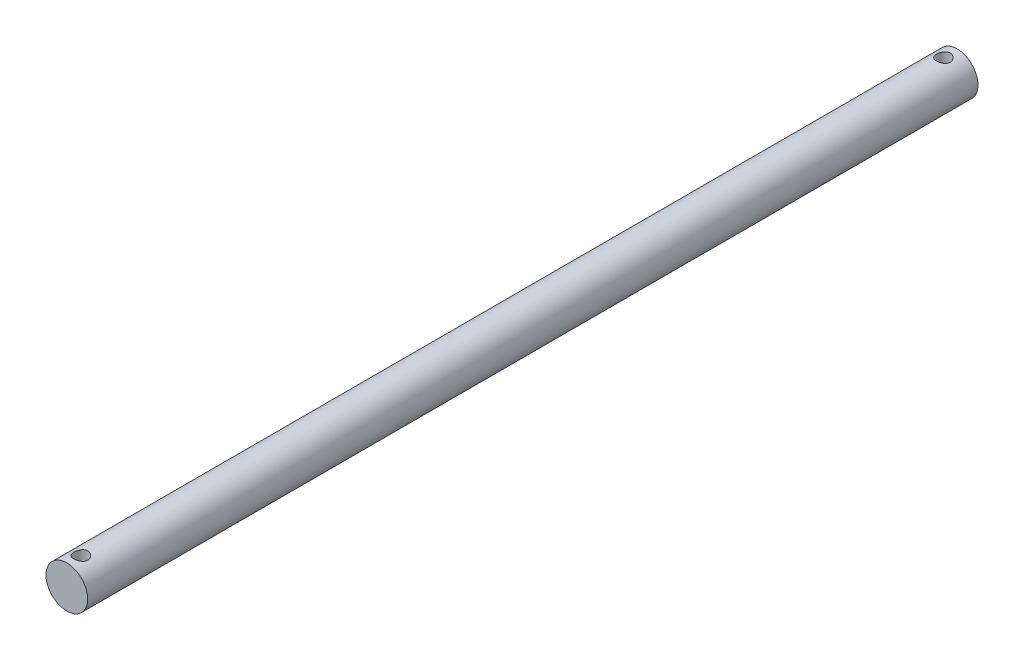
ISO-10303-21;
HEADER;
FILE_DESCRIPTION(('STEP AP214'),'2;1');
FILE_NAME('part.step','',(''),(''),'','','');
FILE_SCHEMA(('AUTOMOTIVE_DESIGN { 1 0 10303 214 1 1 1 1 }'));
ENDSEC;
DATA;
#1=APPLICATION_CONTEXT('core data for automotive mechanical design processes');
#2=APPLICATION_PROTOCOL_DEFINITION('international standard','automotive_design',2000,#1);
#3=PRODUCT_CONTEXT('',#1,'mechanical');
#4=PRODUCT('Part','Part','',(#3));
#5=PRODUCT_RELATED_PRODUCT_CATEGORY('part','',(#4));
#6=PRODUCT_DEFINITION_FORMATION('','',#4);
#7=PRODUCT_DEFINITION_CONTEXT('part definition',#1,'design');
#8=PRODUCT_DEFINITION('design','',#6,#7);
#9=PRODUCT_DEFINITION_SHAPE('','',#8);
#10=(LENGTH_UNIT() NAMED_UNIT(*) SI_UNIT(.MILLI.,.METRE.));
#11=(NAMED_UNIT(*) PLANE_ANGLE_UNIT() SI_UNIT($,.RADIAN.));
#12=(NAMED_UNIT(*) SI_UNIT($,.STERADIAN.) SOLID_ANGLE_UNIT());
#13=UNCERTAINTY_MEASURE_WITH_UNIT(LENGTH_MEASURE(1.E-05),#10,'distance_accuracy_value','');
#14=(GEOMETRIC_REPRESENTATION_CONTEXT(3) GLOBAL_UNCERTAINTY_ASSIGNED_CONTEXT((#13)) GLOBAL_UNIT_ASSIGNED_CONTEXT((#10,
#11,#12)) REPRESENTATION_CONTEXT('',''));
#15=CARTESIAN_POINT('',(0.,0.,0.));
#16=DIRECTION('',(0.,0.,1.));
#17=DIRECTION('',(1.,0.,0.));
#18=AXIS2_PLACEMENT_3D('',#15,#16,#17);
#19=CARTESIAN_POINT('',(0.,0.,101.6));
#20=DIRECTION('',(0.,0.,-1.));
#21=DIRECTION('',(-1.,0.,0.));
#22=AXIS2_PLACEMENT_3D('',#19,#20,#21);
#23=CYLINDRICAL_SURFACE('',#22,4.7625);
#24=CARTESIAN_POINT('',(0.,-4.7625,-96.8375));
#25=CARTESIAN_POINT('',(0.0866193385826736,-4.76250024290249,-96.837499597201));
#26=CARTESIAN_POINT('',(0.173236246329948,-4.76011509093227,-96.844612422477));
#27=CARTESIAN_POINT('',(0.343918795385844,-4.75083521197708,-96.8727887102473));
#28=CARTESIAN_POINT('',(0.427984170888624,-4.74394001683417,-96.8938536210189));
#29=CARTESIAN_POINT('',(0.591078303334069,-4.72638926301478,-96.9491317988722));
#30=CARTESIAN_POINT('',(0.670115223594078,-4.7157399927273,-96.9833230866541));
#31=CARTESIAN_POINT('',(0.821332712178452,-4.6917680757628,-97.0637841118809));
#32=CARTESIAN_POINT('',(0.893511924171946,-4.67844490185098,-97.1100562319416));
#33=CARTESIAN_POINT('',(1.03146490909785,-4.6500112492827,-97.2150484652133));
#34=CARTESIAN_POINT('',(1.09696837422357,-4.63485795886258,-97.2741120843885));
#35=CARTESIAN_POINT('',(1.21734689966456,-4.60470749718205,-97.4022803580967));
#36=CARTESIAN_POINT('',(1.27221961946452,-4.58971036098747,-97.471387217949));
#37=CARTESIAN_POINT('',(1.37132209578673,-4.56109915307672,-97.6201138703744));
#38=CARTESIAN_POINT('',(1.41520046242589,-4.54753724850155,-97.6999788118247));
#39=CARTESIAN_POINT('',(1.48878746228088,-4.52398297352029,-97.8664795499529));
#40=CARTESIAN_POINT('',(1.51850041960149,-4.51398951405184,-97.9531132709959));
#41=CARTESIAN_POINT('',(1.5618991201458,-4.49915443940136,-98.127618739126));
#42=CARTESIAN_POINT('',(1.57609134913143,-4.49415052034258,-98.2153503184764));
#43=CARTESIAN_POINT('',(1.58962903329348,-4.48938104899343,-98.3920812097225));
#44=CARTESIAN_POINT('',(1.58897907629749,-4.48961387798584,-98.4810801213758));
#45=CARTESIAN_POINT('',(1.57324409712918,-4.49514936325486,-98.6534994008299));
#46=CARTESIAN_POINT('',(1.55882008715261,-4.50021985189708,-98.7369888396339));
#47=CARTESIAN_POINT('',(1.51702478352345,-4.51447944137724,-98.9002870536258));
#48=CARTESIAN_POINT('',(1.4896519397146,-4.52366903532271,-98.9800953868782));
#49=CARTESIAN_POINT('',(1.42230325467059,-4.54529683920857,-99.1352677399765));
#50=CARTESIAN_POINT('',(1.38213155232278,-4.55778498196574,-99.2105394904329));
#51=CARTESIAN_POINT('',(1.29046145625624,-4.58458186738966,-99.3534825668941));
#52=CARTESIAN_POINT('',(1.23895979087786,-4.59889113542361,-99.4211516890067));
#53=CARTESIAN_POINT('',(1.12291706563305,-4.62863135053789,-99.5506829120802));
#54=CARTESIAN_POINT('',(1.05783562574614,-4.64408185600813,-99.6120574025332));
#55=CARTESIAN_POINT('',(0.918114067327475,-4.67371014689421,-99.7231483858281));
#56=CARTESIAN_POINT('',(0.84347303311154,-4.68788781016682,-99.7728637605861));
#57=CARTESIAN_POINT('',(0.685716835710946,-4.71355908851247,-99.8596178766232));
#58=CARTESIAN_POINT('',(0.602524951310933,-4.72502468137762,-99.8965259675034));
#59=CARTESIAN_POINT('',(0.430639669841156,-4.7437765034179,-99.9556725386547));
#60=CARTESIAN_POINT('',(0.341948195570989,-4.75106418427121,-99.9779161147347));
#61=CARTESIAN_POINT('',(0.16570932937777,-4.76039857975912,-100.00623836981));
#62=CARTESIAN_POINT('',(0.0782789897854428,-4.76265877911043,-100.012975947062));
#63=CARTESIAN_POINT('',(-0.0964804235618776,-4.76232383028039,-100.011971880662));
#64=CARTESIAN_POINT('',(-0.183809511919946,-4.75972950165738,-100.004232681032));
#65=CARTESIAN_POINT('',(-0.353250287758005,-4.75011789238403,-99.9750160964692));
#66=CARTESIAN_POINT('',(-0.435439830850313,-4.74323090454018,-99.9539431478964));
#67=CARTESIAN_POINT('',(-0.59508383424507,-4.72585806842736,-99.8991629069091));
#68=CARTESIAN_POINT('',(-0.67253768925741,-4.71537176124097,-99.8654540033449));
#69=CARTESIAN_POINT('',(-0.82278267052432,-4.69152178418573,-99.7853756894527));
#70=CARTESIAN_POINT('',(-0.895397560257222,-4.6780896842481,-99.738696583163));
#71=CARTESIAN_POINT('',(-1.03197791784025,-4.64987090592067,-99.6343667868536));
#72=CARTESIAN_POINT('',(-1.09594073387548,-4.63508381455201,-99.5767127460496));
#73=CARTESIAN_POINT('',(-1.2164258561425,-4.60496996168956,-99.448971232777));
#74=CARTESIAN_POINT('',(-1.27247803867766,-4.58964920726292,-99.3784378522536));
#75=CARTESIAN_POINT('',(-1.37200881668867,-4.5608870760535,-99.2286376361002));
#76=CARTESIAN_POINT('',(-1.41548730734048,-4.54744571493929,-99.1493707276684));
#77=CARTESIAN_POINT('',(-1.48843512703597,-4.52409546968821,-98.9843190882273));
#78=CARTESIAN_POINT('',(-1.51793278481197,-4.51417945258854,-98.8985479493196));
#79=CARTESIAN_POINT('',(-1.56193278348048,-4.49914696286489,-98.7228488930549));
#80=CARTESIAN_POINT('',(-1.57644187973938,-4.49402832815028,-98.6329228674206));
#81=CARTESIAN_POINT('',(-1.58952609843278,-4.48941600962756,-98.456437110035));
#82=CARTESIAN_POINT('',(-1.58888153347708,-4.48964685408647,-98.3699417847947));
#83=CARTESIAN_POINT('',(-1.5735971408498,-4.4950264084539,-98.1983604435612));
#84=CARTESIAN_POINT('',(-1.5589581461405,-4.50017482566362,-98.1132743439963));
#85=CARTESIAN_POINT('',(-1.51665275334284,-4.51460432334015,-97.9485346349836));
#86=CARTESIAN_POINT('',(-1.48923906179963,-4.52380505610683,-97.8688085403054));
#87=CARTESIAN_POINT('',(-1.4223672431436,-4.54527283124319,-97.7150264914855));
#88=CARTESIAN_POINT('',(-1.38290644257917,-4.55754055411886,-97.640971800489));
#89=CARTESIAN_POINT('',(-1.2910513494762,-4.58442741396348,-97.4971321739974));
#90=CARTESIAN_POINT('',(-1.23816783538878,-4.59912579731892,-97.4276745532363));
#91=CARTESIAN_POINT('',(-1.12179557697785,-4.62888578099664,-97.2983674212526));
#92=CARTESIAN_POINT('',(-1.05830383406674,-4.64394748298391,-97.2385206360952));
#93=CARTESIAN_POINT('',(-0.919545971611599,-4.67344173459301,-97.1277832454909));
#94=CARTESIAN_POINT('',(-0.843917402680823,-4.68782688609495,-97.0773325979453));
#95=CARTESIAN_POINT('',(-0.684779804883013,-4.71370010986522,-96.9899151941996));
#96=CARTESIAN_POINT('',(-0.601272797535096,-4.72518892253839,-96.9529449908487));
#97=CARTESIAN_POINT('',(-0.432583664931539,-4.7435375517131,-96.8950919084242));
#98=CARTESIAN_POINT('',(-0.34764306531129,-4.75058124720755,-96.8735640848069));
#99=CARTESIAN_POINT('',(-0.175133660416263,-4.76006171214452,-96.8447703044251));
#100=CARTESIAN_POINT('',(-0.0875655880903824,-4.76249975444399,-96.8375004071992));
#101=CARTESIAN_POINT('',(0.,-4.7625,-96.8375));
#102=B_SPLINE_CURVE_WITH_KNOTS('',3,(#24,#25,#26,#27,#28,#29,#30,#31,#32,#33,#34,#35,#36,#37,
#38,#39,#40,#41,#42,#43,#44,#45,#46,#47,#48,#49,#50,#51,#52,#53,#54,#55,#56,#57,#58,#59,#60,#61,
#62,#63,#64,#65,#66,#67,#68,#69,#70,#71,#72,#73,#74,#75,#76,#77,#78,#79,#80,#81,#82,#83,#84,#85,
#86,#87,#88,#89,#90,#91,#92,#93,#94,#95,#96,#97,#98,#99,#100,#101),.UNSPECIFIED.,.T.,.F.,(4,2,2,
2,2,2,2,2,2,2,2,2,2,2,2,2,2,2,2,2,2,2,2,2,2,2,2,2,2,2,2,2,2,2,2,2,2,2,4),(0.,0.259535780816295,
0.519098506612189,0.778228493181558,1.03740962475607,1.30468186298876,1.57201287843955,
1.8470306090726,2.12196433449873,2.38763057115172,2.65321468955133,2.90666212150156,
3.16013990233077,3.41769971708768,3.67533400311154,3.94641872975545,4.21752944222007,
4.49132968969943,4.76503474342568,5.02687563290582,5.2886723214813,5.54288575790413,
5.79713161888515,6.05806509751932,6.31907837054752,6.59195123823193,6.86482638073056,
7.13714621949997,7.40934326970521,7.6675561987701,7.92575375970308,8.17904744490163,
8.43239738104363,8.69680230873238,8.96128210158998,9.23606961575722,9.51078681329525,
9.7732303641843,10.0356013733555),.UNSPECIFIED.);
#103=CARTESIAN_POINT('',(0.,-4.7625,-96.8375));
#104=VERTEX_POINT('',#103);
#105=EDGE_CURVE('E49',#104,#104,#102,.T.);
#106=ORIENTED_EDGE('',*,*,#105,.T.);
#107=EDGE_LOOP('',(#106));
#108=FACE_BOUND('',#107,.T.);
#109=CARTESIAN_POINT('',(0.,4.7625,-96.8375));
#110=CARTESIAN_POINT('',(-0.0866193385826737,4.76250024290248,-96.837499597201));
#111=CARTESIAN_POINT('',(-0.173236246329949,4.76011509093227,-96.844612422477));
#112=CARTESIAN_POINT('',(-0.343918795385844,4.75083521197708,-96.8727887102473));
#113=CARTESIAN_POINT('',(-0.427984170888624,4.74394001683417,-96.8938536210189));
#114=CARTESIAN_POINT('',(-0.59107830333407,4.72638926301478,-96.9491317988722));
#115=CARTESIAN_POINT('',(-0.670115223594078,4.7157399927273,-96.9833230866541));
#116=CARTESIAN_POINT('',(-0.821332712178452,4.6917680757628,-97.0637841118809));
#117=CARTESIAN_POINT('',(-0.893511924171947,4.67844490185098,-97.1100562319416));
#118=CARTESIAN_POINT('',(-1.03146490909785,4.6500112492827,-97.2150484652133));
#119=CARTESIAN_POINT('',(-1.09696837422357,4.63485795886258,-97.2741120843885));
#120=CARTESIAN_POINT('',(-1.21734689966456,4.60470749718205,-97.4022803580967));
#121=CARTESIAN_POINT('',(-1.27221961946452,4.58971036098747,-97.471387217949));
#122=CARTESIAN_POINT('',(-1.37132209578673,4.56109915307672,-97.6201138703744));
#123=CARTESIAN_POINT('',(-1.41520046242589,4.54753724850155,-97.6999788118247));
#124=CARTESIAN_POINT('',(-1.48878746228088,4.52398297352029,-97.8664795499529));
#125=CARTESIAN_POINT('',(-1.51850041960149,4.51398951405184,-97.9531132709959));
#126=CARTESIAN_POINT('',(-1.5618991201458,4.49915443940136,-98.127618739126));
#127=CARTESIAN_POINT('',(-1.57609134913143,4.49415052034258,-98.2153503184764));
#128=CARTESIAN_POINT('',(-1.58962903329348,4.48938104899343,-98.3920812097225));
#129=CARTESIAN_POINT('',(-1.58897907629749,4.48961387798584,-98.4810801213758));
#130=CARTESIAN_POINT('',(-1.57324409712918,4.49514936325486,-98.6534994008299));
#131=CARTESIAN_POINT('',(-1.5588200871526,4.50021985189709,-98.7369888396339));
#132=CARTESIAN_POINT('',(-1.51702478352345,4.51447944137725,-98.9002870536259));
#133=CARTESIAN_POINT('',(-1.48965193971459,4.52366903532271,-98.9800953868782));
#134=CARTESIAN_POINT('',(-1.42230325467058,4.54529683920858,-99.1352677399765));
#135=CARTESIAN_POINT('',(-1.38213155232278,4.55778498196574,-99.2105394904329));
#136=CARTESIAN_POINT('',(-1.29046145625623,4.58458186738966,-99.3534825668941));
#137=CARTESIAN_POINT('',(-1.23895979087786,4.59889113542361,-99.4211516890067));
#138=CARTESIAN_POINT('',(-1.12291706563305,4.62863135053789,-99.5506829120802));
#139=CARTESIAN_POINT('',(-1.05783562574614,4.64408185600813,-99.6120574025332));
#140=CARTESIAN_POINT('',(-0.918114067327475,4.67371014689421,-99.7231483858281));
#141=CARTESIAN_POINT('',(-0.843473033111539,4.68788781016682,-99.7728637605861));
#142=CARTESIAN_POINT('',(-0.685716835710946,4.71355908851247,-99.8596178766232));
#143=CARTESIAN_POINT('',(-0.602524951310932,4.72502468137762,-99.8965259675034));
#144=CARTESIAN_POINT('',(-0.430639669841155,4.7437765034179,-99.9556725386547));
#145=CARTESIAN_POINT('',(-0.341948195570988,4.75106418427121,-99.9779161147347));
#146=CARTESIAN_POINT('',(-0.165709329377769,4.76039857975912,-100.00623836981));
#147=CARTESIAN_POINT('',(-0.0782789897854419,4.76265877911043,-100.012975947062));
#148=CARTESIAN_POINT('',(0.0964804235618788,4.76232383028039,-100.011971880662));
#149=CARTESIAN_POINT('',(0.183809511919947,4.75972950165738,-100.004232681032));
#150=CARTESIAN_POINT('',(0.353250287758007,4.75011789238403,-99.9750160964692));
#151=CARTESIAN_POINT('',(0.435439830850315,4.74323090454018,-99.9539431478964));
#152=CARTESIAN_POINT('',(0.595083834245073,4.72585806842736,-99.8991629069091));
#153=CARTESIAN_POINT('',(0.672537689257413,4.71537176124097,-99.8654540033449));
#154=CARTESIAN_POINT('',(0.822782670524323,4.69152178418573,-99.7853756894527));
#155=CARTESIAN_POINT('',(0.895397560257224,4.6780896842481,-99.738696583163));
#156=CARTESIAN_POINT('',(1.03197791784025,4.64987090592067,-99.6343667868536));
#157=CARTESIAN_POINT('',(1.09594073387548,4.63508381455201,-99.5767127460496));
#158=CARTESIAN_POINT('',(1.2164258561425,4.60496996168956,-99.448971232777));
#159=CARTESIAN_POINT('',(1.27247803867766,4.58964920726292,-99.3784378522536));
#160=CARTESIAN_POINT('',(1.37200881668867,4.5608870760535,-99.2286376361002));
#161=CARTESIAN_POINT('',(1.41548730734048,4.54744571493929,-99.1493707276684));
#162=CARTESIAN_POINT('',(1.48843512703598,4.52409546968821,-98.9843190882273));
#163=CARTESIAN_POINT('',(1.51793278481197,4.51417945258854,-98.8985479493196));
#164=CARTESIAN_POINT('',(1.56193278348048,4.49914696286489,-98.7228488930549));
#165=CARTESIAN_POINT('',(1.57644187973938,4.49402832815028,-98.6329228674206));
#166=CARTESIAN_POINT('',(1.58952609843278,4.48941600962756,-98.456437110035));
#167=CARTESIAN_POINT('',(1.58888153347708,4.48964685408647,-98.3699417847947));
#168=CARTESIAN_POINT('',(1.5735971408498,4.49502640845389,-98.1983604435612));
#169=CARTESIAN_POINT('',(1.5589581461405,4.50017482566362,-98.1132743439963));
#170=CARTESIAN_POINT('',(1.51665275334284,4.51460432334015,-97.9485346349836));
#171=CARTESIAN_POINT('',(1.48923906179963,4.52380505610683,-97.8688085403054));
#172=CARTESIAN_POINT('',(1.4223672431436,4.54527283124319,-97.7150264914855));
#173=CARTESIAN_POINT('',(1.38290644257917,4.55754055411886,-97.640971800489));
#174=CARTESIAN_POINT('',(1.2910513494762,4.58442741396348,-97.4971321739974));
#175=CARTESIAN_POINT('',(1.23816783538878,4.59912579731892,-97.4276745532363));
#176=CARTESIAN_POINT('',(1.12179557697785,4.62888578099664,-97.2983674212526));
#177=CARTESIAN_POINT('',(1.05830383406674,4.64394748298391,-97.2385206360952));
#178=CARTESIAN_POINT('',(0.919545971611597,4.67344173459301,-97.1277832454909));
#179=CARTESIAN_POINT('',(0.843917402680819,4.68782688609495,-97.0773325979453));
#180=CARTESIAN_POINT('',(0.684779804883009,4.71370010986522,-96.9899151941996));
#181=CARTESIAN_POINT('',(0.601272797535094,4.72518892253839,-96.9529449908487));
#182=CARTESIAN_POINT('',(0.43258366493154,4.7435375517131,-96.8950919084242));
#183=CARTESIAN_POINT('',(0.347643065311291,4.75058124720755,-96.8735640848069));
#184=CARTESIAN_POINT('',(0.175133660416263,4.76006171214452,-96.8447703044251));
#185=CARTESIAN_POINT('',(0.0875655880903825,4.76249975444399,-96.8375004071992));
#186=CARTESIAN_POINT('',(0.,4.7625,-96.8375));
#187=B_SPLINE_CURVE_WITH_KNOTS('',3,(#109,#110,#111,#112,#113,#114,#115,#116,#117,#118,#119,
#120,#121,#122,#123,#124,#125,#126,#127,#128,#129,#130,#131,#132,#133,#134,#135,#136,#137,#138,
#139,#140,#141,#142,#143,#144,#145,#146,#147,#148,#149,#150,#151,#152,#153,#154,#155,#156,#157,
#158,#159,#160,#161,#162,#163,#164,#165,#166,#167,#168,#169,#170,#171,#172,#173,#174,#175,#176,
#177,#178,#179,#180,#181,#182,#183,#184,#185,#186),.UNSPECIFIED.,.T.,.F.,(4,2,2,2,2,2,2,2,2,2,2,
2,2,2,2,2,2,2,2,2,2,2,2,2,2,2,2,2,2,2,2,2,2,2,2,2,2,2,4),(0.,0.259535780816295,0.51909850661219,
0.778228493181558,1.03740962475607,1.30468186298876,1.57201287843955,1.8470306090726,
2.12196433449873,2.38763057115172,2.65321468955133,2.90666212150158,3.16013990233078,
3.4176997170877,3.67533400311154,3.94641872975545,4.21752944222007,4.49132968969943,
4.76503474342568,5.02687563290582,5.2886723214813,5.54288575790414,5.79713161888515,
6.05806509751932,6.31907837054752,6.59195123823193,6.86482638073058,7.13714621949999,
7.40934326970522,7.66755619877011,7.92575375970308,8.17904744490163,8.43239738104363,
8.69680230873238,8.96128210158998,9.23606961575723,9.51078681329526,9.7732303641843,
10.0356013733555),.UNSPECIFIED.);
#188=CARTESIAN_POINT('',(0.,4.7625,-96.8375));
#189=VERTEX_POINT('',#188);
#190=EDGE_CURVE('E54',#189,#189,#187,.T.);
#191=ORIENTED_EDGE('',*,*,#190,.T.);
#192=EDGE_LOOP('',(#191));
#193=FACE_BOUND('',#192,.T.);
#194=CARTESIAN_POINT('',(0.,0.,101.6));
#195=DIRECTION('',(0.,0.,1.));
#196=DIRECTION('',(1.,0.,0.));
#197=AXIS2_PLACEMENT_3D('',#194,#195,#196);
#198=CIRCLE('',#197,4.7625);
#199=CARTESIAN_POINT('',(4.7625,0.,101.6));
#200=VERTEX_POINT('',#199);
#201=EDGE_CURVE('E79',#200,#200,#198,.T.);
#202=ORIENTED_EDGE('',*,*,#201,.F.);
#203=EDGE_LOOP('',(#202));
#204=FACE_BOUND('',#203,.T.);
#205=CARTESIAN_POINT('',(0.,0.,-101.6));
#206=DIRECTION('',(0.,0.,1.));
#207=DIRECTION('',(1.,0.,0.));
#208=AXIS2_PLACEMENT_3D('',#205,#206,#207);
#209=CIRCLE('',#208,4.7625);
#210=CARTESIAN_POINT('',(4.7625,0.,-101.6));
#211=VERTEX_POINT('',#210);
#212=EDGE_CURVE('E80',#211,#211,#209,.T.);
#213=ORIENTED_EDGE('',*,*,#212,.T.);
#214=EDGE_LOOP('',(#213));
#215=FACE_BOUND('',#214,.T.);
#216=CARTESIAN_POINT('',(0.,4.7625,100.0125));
#217=CARTESIAN_POINT('',(0.0866193385826738,4.76250024290248,100.012500402799));
#218=CARTESIAN_POINT('',(0.173236246329949,4.76011509093227,100.005387577523));
#219=CARTESIAN_POINT('',(0.343918795385844,4.75083521197708,99.9772112897527));
#220=CARTESIAN_POINT('',(0.427984170888624,4.74394001683417,99.9561463789811));
#221=CARTESIAN_POINT('',(0.59107830333407,4.72638926301478,99.9008682011278));
#222=CARTESIAN_POINT('',(0.670115223594078,4.7157399927273,99.8666769133459));
#223=CARTESIAN_POINT('',(0.821332712178452,4.6917680757628,99.7862158881191));
#224=CARTESIAN_POINT('',(0.893511924171947,4.67844490185098,99.7399437680584));
#225=CARTESIAN_POINT('',(1.03146490909785,4.6500112492827,99.6349515347867));
#226=CARTESIAN_POINT('',(1.09696837422357,4.63485795886258,99.5758879156115));
#227=CARTESIAN_POINT('',(1.21734689966456,4.60470749718205,99.4477196419033));
#228=CARTESIAN_POINT('',(1.27221961946452,4.58971036098747,99.378612782051));
#229=CARTESIAN_POINT('',(1.37132209578673,4.56109915307672,99.2298861296256));
#230=CARTESIAN_POINT('',(1.41520046242589,4.54753724850155,99.1500211881752));
#231=CARTESIAN_POINT('',(1.48878746228088,4.52398297352029,98.9835204500471));
#232=CARTESIAN_POINT('',(1.51850041960149,4.51398951405184,98.8968867290041));
#233=CARTESIAN_POINT('',(1.5618991201458,4.49915443940136,98.722381260874));
#234=CARTESIAN_POINT('',(1.57609134913143,4.49415052034258,98.6346496815236));
#235=CARTESIAN_POINT('',(1.58962903329348,4.48938104899343,98.4579187902775));
#236=CARTESIAN_POINT('',(1.58897907629749,4.48961387798584,98.3689198786242));
#237=CARTESIAN_POINT('',(1.57324409712918,4.49514936325486,98.1965005991701));
#238=CARTESIAN_POINT('',(1.5588200871526,4.50021985189709,98.1130111603661));
#239=CARTESIAN_POINT('',(1.51702478352345,4.51447944137725,97.9497129463741));
#240=CARTESIAN_POINT('',(1.48965193971459,4.52366903532271,97.8699046131218));
#241=CARTESIAN_POINT('',(1.42230325467058,4.54529683920858,97.7147322600235));
#242=CARTESIAN_POINT('',(1.38213155232278,4.55778498196574,97.6394605095671));
#243=CARTESIAN_POINT('',(1.29046145625623,4.58458186738966,97.4965174331059));
#244=CARTESIAN_POINT('',(1.23895979087786,4.59889113542361,97.4288483109933));
#245=CARTESIAN_POINT('',(1.12291706563305,4.62863135053789,97.2993170879198));
#246=CARTESIAN_POINT('',(1.05783562574615,4.64408185600813,97.2379425974669));
#247=CARTESIAN_POINT('',(0.918114067327479,4.67371014689421,97.1268516141719));
#248=CARTESIAN_POINT('',(0.843473033111542,4.68788781016682,97.0771362394139));
#249=CARTESIAN_POINT('',(0.685716835710947,4.71355908851247,96.9903821233768));
#250=CARTESIAN_POINT('',(0.602524951310933,4.72502468137762,96.9534740324966));
#251=CARTESIAN_POINT('',(0.430639669841155,4.7437765034179,96.8943274613453));
#252=CARTESIAN_POINT('',(0.341948195570988,4.75106418427121,96.8720838852653));
#253=CARTESIAN_POINT('',(0.165709329377769,4.76039857975912,96.8437616301895));
#254=CARTESIAN_POINT('',(0.0782789897854419,4.76265877911043,96.8370240529383));
#255=CARTESIAN_POINT('',(-0.0964804235618788,4.76232383028039,96.8380281193376));
#256=CARTESIAN_POINT('',(-0.183809511919947,4.75972950165738,96.845767318968));
#257=CARTESIAN_POINT('',(-0.353250287758007,4.75011789238403,96.8749839035308));
#258=CARTESIAN_POINT('',(-0.435439830850315,4.74323090454018,96.8960568521036));
#259=CARTESIAN_POINT('',(-0.595083834245073,4.72585806842736,96.9508370930909));
#260=CARTESIAN_POINT('',(-0.672537689257413,4.71537176124097,96.9845459966551));
#261=CARTESIAN_POINT('',(-0.822782670524323,4.69152178418573,97.0646243105473));
#262=CARTESIAN_POINT('',(-0.895397560257224,4.6780896842481,97.111303416837));
#263=CARTESIAN_POINT('',(-1.03197791784025,4.64987090592067,97.2156332131464));
#264=CARTESIAN_POINT('',(-1.09594073387548,4.63508381455201,97.2732872539504));
#265=CARTESIAN_POINT('',(-1.2164258561425,4.60496996168956,97.401028767223));
#266=CARTESIAN_POINT('',(-1.27247803867766,4.58964920726292,97.4715621477464));
#267=CARTESIAN_POINT('',(-1.37200881668867,4.5608870760535,97.6213623638998));
#268=CARTESIAN_POINT('',(-1.41548730734048,4.54744571493929,97.7006292723316));
#269=CARTESIAN_POINT('',(-1.48843512703598,4.52409546968821,97.8656809117727));
#270=CARTESIAN_POINT('',(-1.51793278481197,4.51417945258854,97.9514520506804));
#271=CARTESIAN_POINT('',(-1.56193278348048,4.49914696286489,98.1271511069451));
#272=CARTESIAN_POINT('',(-1.57644187973938,4.49402832815028,98.2170771325794));
#273=CARTESIAN_POINT('',(-1.58952609843278,4.48941600962756,98.393562889965));
#274=CARTESIAN_POINT('',(-1.58888153347708,4.48964685408647,98.4800582152053));
#275=CARTESIAN_POINT('',(-1.5735971408498,4.49502640845389,98.6516395564388));
#276=CARTESIAN_POINT('',(-1.5589581461405,4.50017482566362,98.7367256560037));
#277=CARTESIAN_POINT('',(-1.51665275334284,4.51460432334015,98.9014653650164));
#278=CARTESIAN_POINT('',(-1.48923906179963,4.52380505610683,98.9811914596946));
#279=CARTESIAN_POINT('',(-1.4223672431436,4.54527283124319,99.1349735085145));
#280=CARTESIAN_POINT('',(-1.38290644257917,4.55754055411886,99.209028199511));
#281=CARTESIAN_POINT('',(-1.2910513494762,4.58442741396348,99.3528678260026));
#282=CARTESIAN_POINT('',(-1.23816783538878,4.59912579731893,99.4223254467637));
#283=CARTESIAN_POINT('',(-1.12179557697785,4.62888578099664,99.5516325787474));
#284=CARTESIAN_POINT('',(-1.05830383406673,4.64394748298391,99.6114793639048));
#285=CARTESIAN_POINT('',(-0.9195459716116,4.67344173459301,99.7222167545091));
#286=CARTESIAN_POINT('',(-0.843917402680827,4.68782688609495,99.7726674020547));
#287=CARTESIAN_POINT('',(-0.684779804883018,4.71370010986522,99.8600848058004));
#288=CARTESIAN_POINT('',(-0.601272797535098,4.72518892253839,99.8970550091512));
#289=CARTESIAN_POINT('',(-0.432583664931539,4.7435375517131,99.9549080915758));
#290=CARTESIAN_POINT('',(-0.347643065311291,4.75058124720755,99.9764359151931));
#291=CARTESIAN_POINT('',(-0.175133660416263,4.76006171214452,100.005229695575));
#292=CARTESIAN_POINT('',(-0.0875655880903826,4.76249975444399,100.012499592801));
#293=CARTESIAN_POINT('',(0.,4.7625,100.0125));
#294=B_SPLINE_CURVE_WITH_KNOTS('',3,(#216,#217,#218,#219,#220,#221,#222,#223,#224,#225,#226,
#227,#228,#229,#230,#231,#232,#233,#234,#235,#236,#237,#238,#239,#240,#241,#242,#243,#244,#245,
#246,#247,#248,#249,#250,#251,#252,#253,#254,#255,#256,#257,#258,#259,#260,#261,#262,#263,#264,
#265,#266,#267,#268,#269,#270,#271,#272,#273,#274,#275,#276,#277,#278,#279,#280,#281,#282,#283,
#284,#285,#286,#287,#288,#289,#290,#291,#292,#293),.UNSPECIFIED.,.T.,.F.,(4,2,2,2,2,2,2,2,2,2,2,
2,2,2,2,2,2,2,2,2,2,2,2,2,2,2,2,2,2,2,2,2,2,2,2,2,2,2,4),(0.,0.259535780816295,0.51909850661219,
0.778228493181558,1.03740962475607,1.30468186298876,1.57201287843955,1.8470306090726,
2.12196433449873,2.38763057115172,2.65321468955133,2.90666212150158,3.16013990233078,
3.4176997170877,3.67533400311154,3.94641872975544,4.21752944222007,4.49132968969943,
4.76503474342568,5.02687563290582,5.2886723214813,5.54288575790414,5.79713161888515,
6.05806509751932,6.31907837054752,6.59195123823193,6.86482638073058,7.13714621949999,
7.40934326970521,7.6675561987701,7.92575375970308,8.17904744490163,8.43239738104363,
8.69680230873239,8.96128210158998,9.23606961575721,9.51078681329526,9.7732303641843,
10.0356013733555),.UNSPECIFIED.);
#295=CARTESIAN_POINT('',(0.,4.7625,100.0125));
#296=VERTEX_POINT('',#295);
#297=EDGE_CURVE('E45',#296,#296,#294,.T.);
#298=ORIENTED_EDGE('',*,*,#297,.F.);
#299=EDGE_LOOP('',(#298));
#300=FACE_BOUND('',#299,.T.);
#301=CARTESIAN_POINT('',(0.,-4.7625,100.0125));
#302=CARTESIAN_POINT('',(-0.0866193385826736,-4.76250024290249,100.012500402799));
#303=CARTESIAN_POINT('',(-0.173236246329948,-4.76011509093227,100.005387577523));
#304=CARTESIAN_POINT('',(-0.343918795385844,-4.75083521197708,99.9772112897527));
#305=CARTESIAN_POINT('',(-0.427984170888624,-4.74394001683417,99.9561463789811));
#306=CARTESIAN_POINT('',(-0.591078303334069,-4.72638926301478,99.9008682011278));
#307=CARTESIAN_POINT('',(-0.670115223594078,-4.7157399927273,99.8666769133459));
#308=CARTESIAN_POINT('',(-0.821332712178452,-4.6917680757628,99.7862158881191));
#309=CARTESIAN_POINT('',(-0.893511924171946,-4.67844490185098,99.7399437680584));
#310=CARTESIAN_POINT('',(-1.03146490909785,-4.6500112492827,99.6349515347867));
#311=CARTESIAN_POINT('',(-1.09696837422357,-4.63485795886258,99.5758879156115));
#312=CARTESIAN_POINT('',(-1.21734689966456,-4.60470749718205,99.4477196419033));
#313=CARTESIAN_POINT('',(-1.27221961946452,-4.58971036098747,99.378612782051));
#314=CARTESIAN_POINT('',(-1.37132209578673,-4.56109915307672,99.2298861296256));
#315=CARTESIAN_POINT('',(-1.41520046242589,-4.54753724850155,99.1500211881752));
#316=CARTESIAN_POINT('',(-1.48878746228088,-4.52398297352029,98.9835204500471));
#317=CARTESIAN_POINT('',(-1.51850041960149,-4.51398951405184,98.8968867290041));
#318=CARTESIAN_POINT('',(-1.5618991201458,-4.49915443940136,98.722381260874));
#319=CARTESIAN_POINT('',(-1.57609134913143,-4.49415052034258,98.6346496815236));
#320=CARTESIAN_POINT('',(-1.58962903329348,-4.48938104899343,98.4579187902775));
#321=CARTESIAN_POINT('',(-1.58897907629749,-4.48961387798584,98.3689198786242));
#322=CARTESIAN_POINT('',(-1.57324409712918,-4.49514936325486,98.1965005991701));
#323=CARTESIAN_POINT('',(-1.55882008715261,-4.50021985189708,98.1130111603661));
#324=CARTESIAN_POINT('',(-1.51702478352345,-4.51447944137724,97.9497129463741));
#325=CARTESIAN_POINT('',(-1.4896519397146,-4.52366903532271,97.8699046131218));
#326=CARTESIAN_POINT('',(-1.42230325467059,-4.54529683920857,97.7147322600235));
#327=CARTESIAN_POINT('',(-1.38213155232278,-4.55778498196574,97.6394605095671));
#328=CARTESIAN_POINT('',(-1.29046145625623,-4.58458186738966,97.4965174331059));
#329=CARTESIAN_POINT('',(-1.23895979087786,-4.59889113542361,97.4288483109933));
#330=CARTESIAN_POINT('',(-1.12291706563305,-4.62863135053789,97.2993170879198));
#331=CARTESIAN_POINT('',(-1.05783562574614,-4.64408185600813,97.2379425974668));
#332=CARTESIAN_POINT('',(-0.918114067327476,-4.67371014689421,97.1268516141719));
#333=CARTESIAN_POINT('',(-0.84347303311154,-4.68788781016682,97.0771362394139));
#334=CARTESIAN_POINT('',(-0.685716835710946,-4.71355908851247,96.9903821233768));
#335=CARTESIAN_POINT('',(-0.602524951310933,-4.72502468137762,96.9534740324966));
#336=CARTESIAN_POINT('',(-0.430639669841156,-4.7437765034179,96.8943274613453));
#337=CARTESIAN_POINT('',(-0.341948195570989,-4.75106418427121,96.8720838852653));
#338=CARTESIAN_POINT('',(-0.16570932937777,-4.76039857975912,96.8437616301895));
#339=CARTESIAN_POINT('',(-0.0782789897854429,-4.76265877911043,96.8370240529383));
#340=CARTESIAN_POINT('',(0.0964804235618776,-4.76232383028039,96.8380281193376));
#341=CARTESIAN_POINT('',(0.183809511919946,-4.75972950165738,96.845767318968));
#342=CARTESIAN_POINT('',(0.353250287758005,-4.75011789238403,96.8749839035308));
#343=CARTESIAN_POINT('',(0.435439830850312,-4.74323090454018,96.8960568521036));
#344=CARTESIAN_POINT('',(0.59508383424507,-4.72585806842736,96.9508370930909));
#345=CARTESIAN_POINT('',(0.67253768925741,-4.71537176124097,96.9845459966551));
#346=CARTESIAN_POINT('',(0.822782670524318,-4.69152178418573,97.0646243105473));
#347=CARTESIAN_POINT('',(0.895397560257217,-4.67808968424811,97.111303416837));
#348=CARTESIAN_POINT('',(1.03197791784024,-4.64987090592067,97.2156332131464));
#349=CARTESIAN_POINT('',(1.09594073387548,-4.63508381455201,97.2732872539504));
#350=CARTESIAN_POINT('',(1.2164258561425,-4.60496996168956,97.401028767223));
#351=CARTESIAN_POINT('',(1.27247803867766,-4.58964920726292,97.4715621477464));
#352=CARTESIAN_POINT('',(1.37200881668867,-4.5608870760535,97.6213623638998));
#353=CARTESIAN_POINT('',(1.41548730734048,-4.54744571493929,97.7006292723316));
#354=CARTESIAN_POINT('',(1.48843512703597,-4.52409546968821,97.8656809117727));
#355=CARTESIAN_POINT('',(1.51793278481197,-4.51417945258854,97.9514520506804));
#356=CARTESIAN_POINT('',(1.56193278348048,-4.49914696286489,98.1271511069451));
#357=CARTESIAN_POINT('',(1.57644187973938,-4.49402832815028,98.2170771325794));
#358=CARTESIAN_POINT('',(1.58952609843278,-4.48941600962756,98.393562889965));
#359=CARTESIAN_POINT('',(1.58888153347708,-4.48964685408647,98.4800582152053));
#360=CARTESIAN_POINT('',(1.5735971408498,-4.4950264084539,98.6516395564388));
#361=CARTESIAN_POINT('',(1.5589581461405,-4.50017482566362,98.7367256560037));
#362=CARTESIAN_POINT('',(1.51665275334284,-4.51460432334015,98.9014653650164));
#363=CARTESIAN_POINT('',(1.48923906179963,-4.52380505610683,98.9811914596946));
#364=CARTESIAN_POINT('',(1.4223672431436,-4.54527283124319,99.1349735085145));
#365=CARTESIAN_POINT('',(1.38290644257917,-4.55754055411886,99.209028199511));
#366=CARTESIAN_POINT('',(1.2910513494762,-4.58442741396348,99.3528678260026));
#367=CARTESIAN_POINT('',(1.23816783538878,-4.59912579731893,99.4223254467637));
#368=CARTESIAN_POINT('',(1.12179557697785,-4.62888578099664,99.5516325787474));
#369=CARTESIAN_POINT('',(1.05830383406673,-4.64394748298391,99.6114793639048));
#370=CARTESIAN_POINT('',(0.919545971611598,-4.67344173459301,99.7222167545091));
#371=CARTESIAN_POINT('',(0.843917402680822,-4.68782688609495,99.7726674020547));
#372=CARTESIAN_POINT('',(0.684779804883013,-4.71370010986522,99.8600848058004));
#373=CARTESIAN_POINT('',(0.601272797535096,-4.72518892253839,99.8970550091512));
#374=CARTESIAN_POINT('',(0.432583664931539,-4.7435375517131,99.9549080915758));
#375=CARTESIAN_POINT('',(0.34764306531129,-4.75058124720755,99.9764359151931));
#376=CARTESIAN_POINT('',(0.175133660416263,-4.76006171214452,100.005229695575));
#377=CARTESIAN_POINT('',(0.0875655880903824,-4.76249975444399,100.012499592801));
#378=CARTESIAN_POINT('',(0.,-4.7625,100.0125));
#379=B_SPLINE_CURVE_WITH_KNOTS('',3,(#301,#302,#303,#304,#305,#306,#307,#308,#309,#310,#311,
#312,#313,#314,#315,#316,#317,#318,#319,#320,#321,#322,#323,#324,#325,#326,#327,#328,#329,#330,
#331,#332,#333,#334,#335,#336,#337,#338,#339,#340,#341,#342,#343,#344,#345,#346,#347,#348,#349,
#350,#351,#352,#353,#354,#355,#356,#357,#358,#359,#360,#361,#362,#363,#364,#365,#366,#367,#368,
#369,#370,#371,#372,#373,#374,#375,#376,#377,#378),.UNSPECIFIED.,.T.,.F.,(4,2,2,2,2,2,2,2,2,2,2,
2,2,2,2,2,2,2,2,2,2,2,2,2,2,2,2,2,2,2,2,2,2,2,2,2,2,2,4),(0.,0.259535780816295,
0.519098506612189,0.778228493181558,1.03740962475607,1.30468186298876,1.57201287843955,
1.8470306090726,2.12196433449873,2.38763057115172,2.65321468955133,2.90666212150156,
3.16013990233077,3.4176997170877,3.67533400311154,3.94641872975545,4.21752944222007,
4.49132968969943,4.76503474342568,5.02687563290582,5.2886723214813,5.54288575790413,
5.79713161888515,6.05806509751931,6.31907837054752,6.59195123823193,6.86482638073056,
7.13714621949997,7.40934326970521,7.6675561987701,7.92575375970308,8.17904744490163,
8.43239738104363,8.69680230873239,8.96128210158998,9.23606961575722,9.51078681329525,
9.7732303641843,10.0356013733555),.UNSPECIFIED.);
#380=CARTESIAN_POINT('',(0.,-4.7625,100.0125));
#381=VERTEX_POINT('',#380);
#382=EDGE_CURVE('E10',#381,#381,#379,.T.);
#383=ORIENTED_EDGE('',*,*,#382,.F.);
#384=EDGE_LOOP('',(#383));
#385=FACE_BOUND('',#384,.T.);
#386=ADVANCED_FACE('F35',(#108,#193,#204,#215,#300,#385),#23,.T.);
#387=CARTESIAN_POINT('',(0.,0.,101.6));
#388=DIRECTION('',(0.,0.,1.));
#389=DIRECTION('',(1.,0.,0.));
#390=AXIS2_PLACEMENT_3D('',#387,#388,#389);
#391=PLANE('',#390);
#392=ORIENTED_EDGE('',*,*,#201,.T.);
#393=EDGE_LOOP('',(#392));
#394=FACE_BOUND('',#393,.T.);
#395=ADVANCED_FACE('F72',(#394),#391,.T.);
#396=CARTESIAN_POINT('',(0.,0.,-101.6));
#397=DIRECTION('',(0.,0.,1.));
#398=DIRECTION('',(1.,0.,0.));
#399=AXIS2_PLACEMENT_3D('',#396,#397,#398);
#400=PLANE('',#399);
#401=ORIENTED_EDGE('',*,*,#212,.F.);
#402=EDGE_LOOP('',(#401));
#403=FACE_BOUND('',#402,.T.);
#404=ADVANCED_FACE('F70',(#403),#400,.F.);
#405=CARTESIAN_POINT('',(0.,-4.7625,-98.425));
#406=DIRECTION('',(0.,1.,0.));
#407=DIRECTION('',(0.,0.,1.));
#408=AXIS2_PLACEMENT_3D('',#405,#406,#407);
#409=CYLINDRICAL_SURFACE('',#408,1.5875);
#410=ORIENTED_EDGE('',*,*,#190,.F.);
#411=EDGE_LOOP('',(#410));
#412=FACE_BOUND('',#411,.T.);
#413=ORIENTED_EDGE('',*,*,#105,.F.);
#414=EDGE_LOOP('',(#413));
#415=FACE_BOUND('',#414,.T.);
#416=ADVANCED_FACE('F65',(#412,#415),#409,.F.);
#417=CARTESIAN_POINT('',(0.,-4.7625,98.425));
#418=DIRECTION('',(0.,1.,0.));
#419=DIRECTION('',(0.,0.,1.));
#420=AXIS2_PLACEMENT_3D('',#417,#418,#419);
#421=CYLINDRICAL_SURFACE('',#420,1.5875);
#422=ORIENTED_EDGE('',*,*,#297,.T.);
#423=EDGE_LOOP('',(#422));
#424=FACE_BOUND('',#423,.T.);
#425=ORIENTED_EDGE('',*,*,#382,.T.);
#426=EDGE_LOOP('',(#425));
#427=FACE_BOUND('',#426,.T.);
#428=ADVANCED_FACE('F62',(#424,#427),#421,.F.);
#429=CLOSED_SHELL('',(#386,#395,#404,#416,#428));
#430=MANIFOLD_SOLID_BREP('B2',#429);
#431=ADVANCED_BREP_SHAPE_REPRESENTATION('',(#18,#430),#14);
#432=SHAPE_DEFINITION_REPRESENTATION(#9,#431);
ENDSEC;
END-ISO-10303-21;
